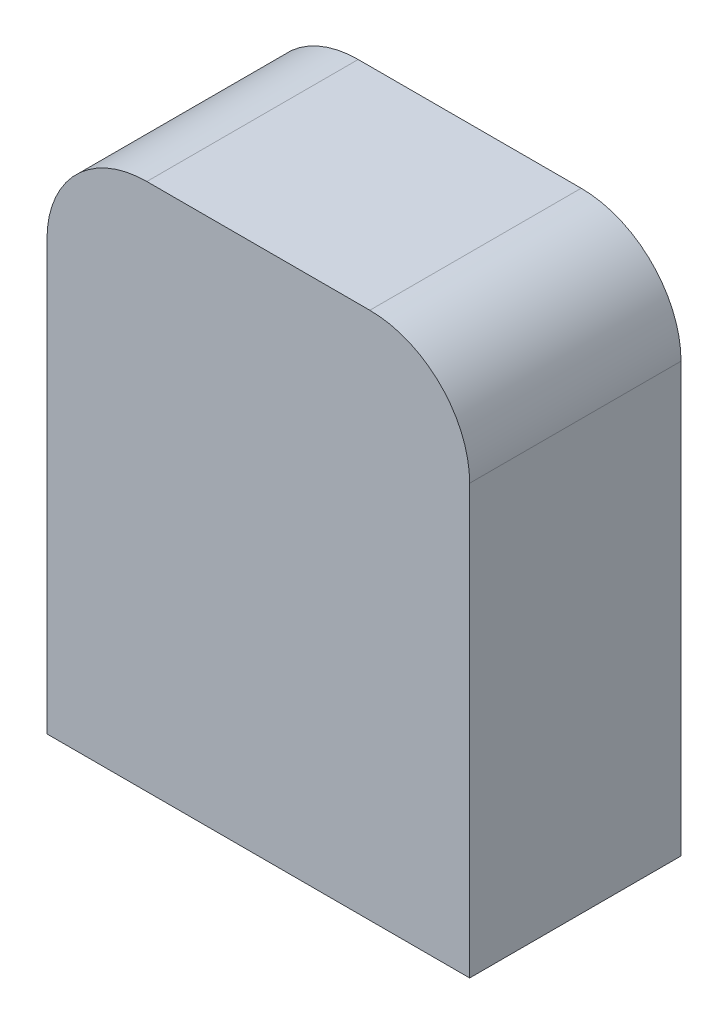
ISO-10303-21;
HEADER;
FILE_DESCRIPTION(('STEP AP214'),'2;1');
FILE_NAME('part.step','',(''),(''),'','','');
FILE_SCHEMA(('AUTOMOTIVE_DESIGN { 1 0 10303 214 1 1 1 1 }'));
ENDSEC;
DATA;
#1=APPLICATION_CONTEXT('core data for automotive mechanical design processes');
#2=APPLICATION_PROTOCOL_DEFINITION('international standard','automotive_design',2000,#1);
#3=PRODUCT_CONTEXT('',#1,'mechanical');
#4=PRODUCT('Part','Part','',(#3));
#5=PRODUCT_RELATED_PRODUCT_CATEGORY('part','',(#4));
#6=PRODUCT_DEFINITION_FORMATION('','',#4);
#7=PRODUCT_DEFINITION_CONTEXT('part definition',#1,'design');
#8=PRODUCT_DEFINITION('design','',#6,#7);
#9=PRODUCT_DEFINITION_SHAPE('','',#8);
#10=(LENGTH_UNIT() NAMED_UNIT(*) SI_UNIT(.MILLI.,.METRE.));
#11=(NAMED_UNIT(*) PLANE_ANGLE_UNIT() SI_UNIT($,.RADIAN.));
#12=(NAMED_UNIT(*) SI_UNIT($,.STERADIAN.) SOLID_ANGLE_UNIT());
#13=UNCERTAINTY_MEASURE_WITH_UNIT(LENGTH_MEASURE(1.E-05),#10,'distance_accuracy_value','');
#14=(GEOMETRIC_REPRESENTATION_CONTEXT(3) GLOBAL_UNCERTAINTY_ASSIGNED_CONTEXT((#13)) GLOBAL_UNIT_ASSIGNED_CONTEXT((#10,
#11,#12)) REPRESENTATION_CONTEXT('',''));
#15=CARTESIAN_POINT('',(0.,0.,0.));
#16=DIRECTION('',(0.,0.,1.));
#17=DIRECTION('',(1.,0.,0.));
#18=AXIS2_PLACEMENT_3D('',#15,#16,#17);
#19=CARTESIAN_POINT('',(0.,0.,6.35));
#20=DIRECTION('',(1.,0.,0.));
#21=DIRECTION('',(0.,0.,-1.));
#22=AXIS2_PLACEMENT_3D('',#19,#20,#21);
#23=PLANE('',#22);
#24=DIRECTION('',(0.,-1.,0.));
#25=VECTOR('',#24,1.);
#26=CARTESIAN_POINT('',(0.,0.,6.35));
#27=LINE('',#26,#25);
#28=CARTESIAN_POINT('',(0.,12.875,6.35));
#29=VERTEX_POINT('',#28);
#30=CARTESIAN_POINT('',(0.,0.,6.35));
#31=VERTEX_POINT('',#30);
#32=EDGE_CURVE('E89',#29,#31,#27,.T.);
#33=ORIENTED_EDGE('',*,*,#32,.F.);
#34=DIRECTION('',(0.,0.,-1.));
#35=VECTOR('',#34,1.);
#36=CARTESIAN_POINT('',(0.,12.875,6.35));
#37=LINE('',#36,#35);
#38=CARTESIAN_POINT('',(0.,12.875,0.));
#39=VERTEX_POINT('',#38);
#40=EDGE_CURVE('E112',#29,#39,#37,.T.);
#41=ORIENTED_EDGE('',*,*,#40,.T.);
#42=DIRECTION('',(0.,-1.,0.));
#43=VECTOR('',#42,1.);
#44=CARTESIAN_POINT('',(0.,0.,0.));
#45=LINE('',#44,#43);
#46=CARTESIAN_POINT('',(0.,0.,0.));
#47=VERTEX_POINT('',#46);
#48=EDGE_CURVE('E110',#39,#47,#45,.T.);
#49=ORIENTED_EDGE('',*,*,#48,.T.);
#50=DIRECTION('',(0.,0.,-1.));
#51=VECTOR('',#50,1.);
#52=CARTESIAN_POINT('',(0.,0.,6.35));
#53=LINE('',#52,#51);
#54=EDGE_CURVE('E104',#31,#47,#53,.T.);
#55=ORIENTED_EDGE('',*,*,#54,.F.);
#56=EDGE_LOOP('',(#33,#41,#49,#55));
#57=FACE_BOUND('',#56,.T.);
#58=ADVANCED_FACE('F35',(#57),#23,.F.);
#59=CARTESIAN_POINT('',(0.,0.,6.35));
#60=DIRECTION('',(0.,1.,0.));
#61=DIRECTION('',(0.,0.,1.));
#62=AXIS2_PLACEMENT_3D('',#59,#60,#61);
#63=PLANE('',#62);
#64=DIRECTION('',(1.,0.,0.));
#65=VECTOR('',#64,1.);
#66=CARTESIAN_POINT('',(0.,0.,0.));
#67=LINE('',#66,#65);
#68=CARTESIAN_POINT('',(12.7,0.,0.));
#69=VERTEX_POINT('',#68);
#70=EDGE_CURVE('E139',#47,#69,#67,.T.);
#71=ORIENTED_EDGE('',*,*,#70,.T.);
#72=DIRECTION('',(0.,0.,-1.));
#73=VECTOR('',#72,1.);
#74=CARTESIAN_POINT('',(12.7,0.,6.35));
#75=LINE('',#74,#73);
#76=CARTESIAN_POINT('',(12.7,0.,6.35));
#77=VERTEX_POINT('',#76);
#78=EDGE_CURVE('E106',#77,#69,#75,.T.);
#79=ORIENTED_EDGE('',*,*,#78,.F.);
#80=DIRECTION('',(1.,0.,0.));
#81=VECTOR('',#80,1.);
#82=CARTESIAN_POINT('',(0.,0.,6.35));
#83=LINE('',#82,#81);
#84=EDGE_CURVE('E92',#31,#77,#83,.T.);
#85=ORIENTED_EDGE('',*,*,#84,.F.);
#86=ORIENTED_EDGE('',*,*,#54,.T.);
#87=EDGE_LOOP('',(#71,#79,#85,#86));
#88=FACE_BOUND('',#87,.T.);
#89=ADVANCED_FACE('F103',(#88),#63,.F.);
#90=CARTESIAN_POINT('',(12.7,0.,6.35));
#91=DIRECTION('',(-1.,0.,0.));
#92=DIRECTION('',(0.,0.,1.));
#93=AXIS2_PLACEMENT_3D('',#90,#91,#92);
#94=PLANE('',#93);
#95=DIRECTION('',(0.,1.,0.));
#96=VECTOR('',#95,1.);
#97=CARTESIAN_POINT('',(12.7,0.,0.));
#98=LINE('',#97,#96);
#99=CARTESIAN_POINT('',(12.7,12.875,0.));
#100=VERTEX_POINT('',#99);
#101=EDGE_CURVE('E137',#69,#100,#98,.T.);
#102=ORIENTED_EDGE('',*,*,#101,.T.);
#103=DIRECTION('',(0.,0.,-1.));
#104=VECTOR('',#103,1.);
#105=CARTESIAN_POINT('',(12.7,12.875,6.35));
#106=LINE('',#105,#104);
#107=CARTESIAN_POINT('',(12.7,12.875,6.35));
#108=VERTEX_POINT('',#107);
#109=EDGE_CURVE('E11',#100,#108,#106,.F.);
#110=ORIENTED_EDGE('',*,*,#109,.T.);
#111=DIRECTION('',(0.,1.,0.));
#112=VECTOR('',#111,1.);
#113=CARTESIAN_POINT('',(12.7,0.,6.35));
#114=LINE('',#113,#112);
#115=EDGE_CURVE('E107',#77,#108,#114,.T.);
#116=ORIENTED_EDGE('',*,*,#115,.F.);
#117=ORIENTED_EDGE('',*,*,#78,.T.);
#118=EDGE_LOOP('',(#102,#110,#116,#117));
#119=FACE_BOUND('',#118,.T.);
#120=ADVANCED_FACE('F138',(#119),#94,.F.);
#121=CARTESIAN_POINT('',(0.,15.875,6.35));
#122=DIRECTION('',(0.,-1.,0.));
#123=DIRECTION('',(0.,0.,-1.));
#124=AXIS2_PLACEMENT_3D('',#121,#122,#123);
#125=PLANE('',#124);
#126=DIRECTION('',(-1.,0.,0.));
#127=VECTOR('',#126,1.);
#128=CARTESIAN_POINT('',(0.,15.875,0.));
#129=LINE('',#128,#127);
#130=CARTESIAN_POINT('',(9.7,15.875,0.));
#131=VERTEX_POINT('',#130);
#132=CARTESIAN_POINT('',(3.,15.875,0.));
#133=VERTEX_POINT('',#132);
#134=EDGE_CURVE('E99',#131,#133,#129,.T.);
#135=ORIENTED_EDGE('',*,*,#134,.T.);
#136=DIRECTION('',(0.,0.,-1.));
#137=VECTOR('',#136,1.);
#138=CARTESIAN_POINT('',(3.,15.875,6.35));
#139=LINE('',#138,#137);
#140=CARTESIAN_POINT('',(3.,15.875,6.35));
#141=VERTEX_POINT('',#140);
#142=EDGE_CURVE('E56',#133,#141,#139,.F.);
#143=ORIENTED_EDGE('',*,*,#142,.T.);
#144=DIRECTION('',(-1.,0.,0.));
#145=VECTOR('',#144,1.);
#146=CARTESIAN_POINT('',(0.,15.875,6.35));
#147=LINE('',#146,#145);
#148=CARTESIAN_POINT('',(9.7,15.875,6.35));
#149=VERTEX_POINT('',#148);
#150=EDGE_CURVE('E116',#149,#141,#147,.T.);
#151=ORIENTED_EDGE('',*,*,#150,.F.);
#152=DIRECTION('',(0.,0.,-1.));
#153=VECTOR('',#152,1.);
#154=CARTESIAN_POINT('',(9.7,15.875,6.35));
#155=LINE('',#154,#153);
#156=EDGE_CURVE('E123',#149,#131,#155,.T.);
#157=ORIENTED_EDGE('',*,*,#156,.T.);
#158=EDGE_LOOP('',(#135,#143,#151,#157));
#159=FACE_BOUND('',#158,.T.);
#160=ADVANCED_FACE('F131',(#159),#125,.F.);
#161=CARTESIAN_POINT('',(0.,15.875,6.35));
#162=DIRECTION('',(0.,0.,-1.));
#163=DIRECTION('',(-1.,0.,0.));
#164=AXIS2_PLACEMENT_3D('',#161,#162,#163);
#165=PLANE('',#164);
#166=ORIENTED_EDGE('',*,*,#150,.T.);
#167=CARTESIAN_POINT('',(3.,12.875,6.35));
#168=DIRECTION('',(0.,0.,-1.));
#169=DIRECTION('',(-1.,0.,0.));
#170=AXIS2_PLACEMENT_3D('',#167,#168,#169);
#171=CIRCLE('',#170,3.);
#172=EDGE_CURVE('E43',#141,#29,#171,.F.);
#173=ORIENTED_EDGE('',*,*,#172,.T.);
#174=ORIENTED_EDGE('',*,*,#32,.T.);
#175=ORIENTED_EDGE('',*,*,#84,.T.);
#176=ORIENTED_EDGE('',*,*,#115,.T.);
#177=CARTESIAN_POINT('',(9.7,12.875,6.35));
#178=DIRECTION('',(0.,0.,-1.));
#179=DIRECTION('',(-1.,0.,0.));
#180=AXIS2_PLACEMENT_3D('',#177,#178,#179);
#181=CIRCLE('',#180,3.);
#182=EDGE_CURVE('E127',#108,#149,#181,.F.);
#183=ORIENTED_EDGE('',*,*,#182,.T.);
#184=EDGE_LOOP('',(#166,#173,#174,#175,#176,#183));
#185=FACE_BOUND('',#184,.T.);
#186=ADVANCED_FACE('F91',(#185),#165,.F.);
#187=CARTESIAN_POINT('',(0.,15.875,0.));
#188=DIRECTION('',(0.,0.,-1.));
#189=DIRECTION('',(-1.,0.,0.));
#190=AXIS2_PLACEMENT_3D('',#187,#188,#189);
#191=PLANE('',#190);
#192=ORIENTED_EDGE('',*,*,#48,.F.);
#193=CARTESIAN_POINT('',(3.,12.875,0.));
#194=DIRECTION('',(0.,0.,-1.));
#195=DIRECTION('',(-1.,0.,0.));
#196=AXIS2_PLACEMENT_3D('',#193,#194,#195);
#197=CIRCLE('',#196,3.);
#198=EDGE_CURVE('E121',#39,#133,#197,.T.);
#199=ORIENTED_EDGE('',*,*,#198,.T.);
#200=ORIENTED_EDGE('',*,*,#134,.F.);
#201=CARTESIAN_POINT('',(9.7,12.875,0.));
#202=DIRECTION('',(0.,0.,-1.));
#203=DIRECTION('',(-1.,0.,0.));
#204=AXIS2_PLACEMENT_3D('',#201,#202,#203);
#205=CIRCLE('',#204,3.);
#206=EDGE_CURVE('E114',#131,#100,#205,.T.);
#207=ORIENTED_EDGE('',*,*,#206,.T.);
#208=ORIENTED_EDGE('',*,*,#101,.F.);
#209=ORIENTED_EDGE('',*,*,#70,.F.);
#210=EDGE_LOOP('',(#192,#199,#200,#207,#208,#209));
#211=FACE_BOUND('',#210,.T.);
#212=ADVANCED_FACE('F136',(#211),#191,.T.);
#213=CARTESIAN_POINT('',(3.,12.875,6.35));
#214=DIRECTION('',(0.,0.,-1.));
#215=DIRECTION('',(-1.,0.,0.));
#216=AXIS2_PLACEMENT_3D('',#213,#214,#215);
#217=CYLINDRICAL_SURFACE('',#216,3.);
#218=ORIENTED_EDGE('',*,*,#172,.F.);
#219=ORIENTED_EDGE('',*,*,#142,.F.);
#220=ORIENTED_EDGE('',*,*,#198,.F.);
#221=ORIENTED_EDGE('',*,*,#40,.F.);
#222=EDGE_LOOP('',(#218,#219,#220,#221));
#223=FACE_BOUND('',#222,.T.);
#224=ADVANCED_FACE('F145',(#223),#217,.T.);
#225=CARTESIAN_POINT('',(9.7,12.875,6.35));
#226=DIRECTION('',(0.,0.,-1.));
#227=DIRECTION('',(-1.,0.,0.));
#228=AXIS2_PLACEMENT_3D('',#225,#226,#227);
#229=CYLINDRICAL_SURFACE('',#228,3.);
#230=ORIENTED_EDGE('',*,*,#182,.F.);
#231=ORIENTED_EDGE('',*,*,#109,.F.);
#232=ORIENTED_EDGE('',*,*,#206,.F.);
#233=ORIENTED_EDGE('',*,*,#156,.F.);
#234=EDGE_LOOP('',(#230,#231,#232,#233));
#235=FACE_BOUND('',#234,.T.);
#236=ADVANCED_FACE('F37',(#235),#229,.T.);
#237=CLOSED_SHELL('',(#58,#89,#120,#160,#186,#212,#224,#236));
#238=MANIFOLD_SOLID_BREP('B2',#237);
#239=ADVANCED_BREP_SHAPE_REPRESENTATION('',(#18,#238),#14);
#240=SHAPE_DEFINITION_REPRESENTATION(#9,#239);
ENDSEC;
END-ISO-10303-21;
